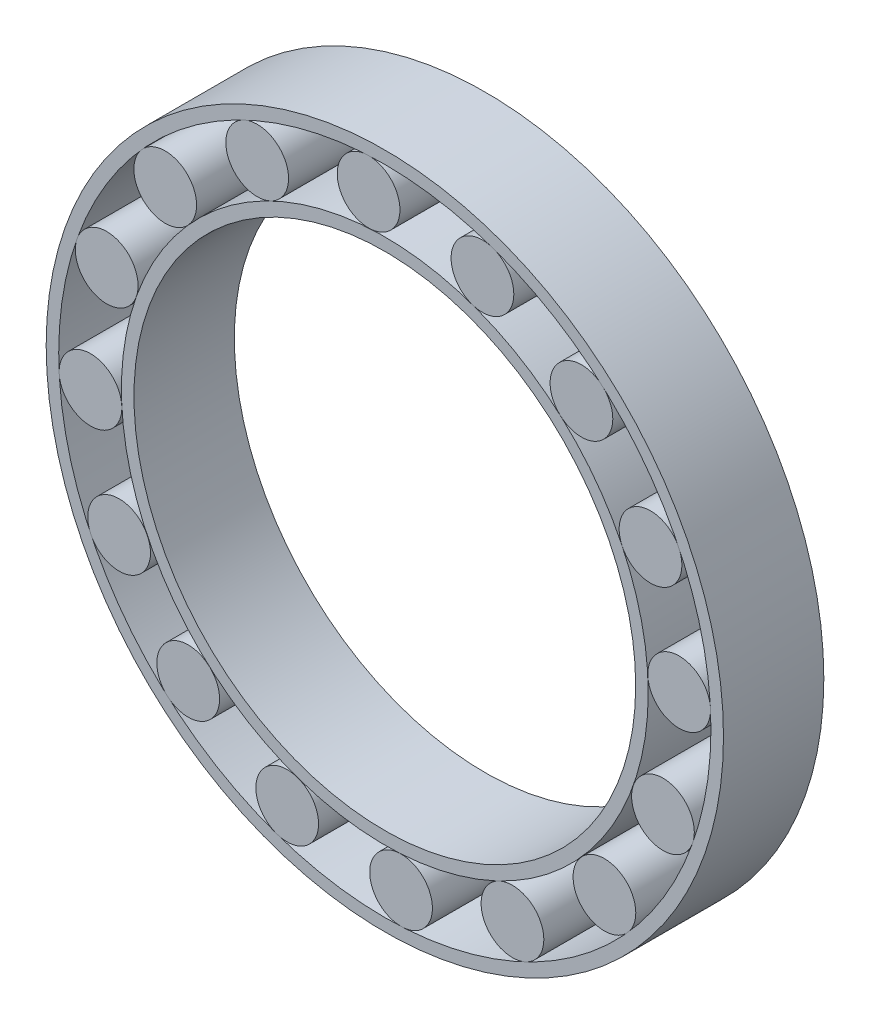
ISO-10303-21;
HEADER;
FILE_DESCRIPTION(('STEP AP214'),'2;1');
FILE_NAME('part.step','',(''),(''),'','','');
FILE_SCHEMA(('AUTOMOTIVE_DESIGN { 1 0 10303 214 1 1 1 1 }'));
ENDSEC;
DATA;
#1=APPLICATION_CONTEXT('core data for automotive mechanical design processes');
#2=APPLICATION_PROTOCOL_DEFINITION('international standard','automotive_design',2000,#1);
#3=PRODUCT_CONTEXT('',#1,'mechanical');
#4=PRODUCT('Part','Part','',(#3));
#5=PRODUCT_RELATED_PRODUCT_CATEGORY('part','',(#4));
#6=PRODUCT_DEFINITION_FORMATION('','',#4);
#7=PRODUCT_DEFINITION_CONTEXT('part definition',#1,'design');
#8=PRODUCT_DEFINITION('design','',#6,#7);
#9=PRODUCT_DEFINITION_SHAPE('','',#8);
#10=(LENGTH_UNIT() NAMED_UNIT(*) SI_UNIT(.MILLI.,.METRE.));
#11=(NAMED_UNIT(*) PLANE_ANGLE_UNIT() SI_UNIT($,.RADIAN.));
#12=(NAMED_UNIT(*) SI_UNIT($,.STERADIAN.) SOLID_ANGLE_UNIT());
#13=UNCERTAINTY_MEASURE_WITH_UNIT(LENGTH_MEASURE(1.E-05),#10,'distance_accuracy_value','');
#14=(GEOMETRIC_REPRESENTATION_CONTEXT(3) GLOBAL_UNCERTAINTY_ASSIGNED_CONTEXT((#13)) GLOBAL_UNIT_ASSIGNED_CONTEXT((#10,
#11,#12)) REPRESENTATION_CONTEXT('',''));
#15=CARTESIAN_POINT('',(0.,0.,0.));
#16=DIRECTION('',(0.,0.,1.));
#17=DIRECTION('',(1.,0.,0.));
#18=AXIS2_PLACEMENT_3D('',#15,#16,#17);
#19=CARTESIAN_POINT('',(7.83809885354114,8.75366816609632,4.));
#20=DIRECTION('',(0.,0.,-1.));
#21=DIRECTION('',(-1.,0.,0.));
#22=AXIS2_PLACEMENT_3D('',#19,#20,#21);
#23=CYLINDRICAL_SURFACE('',#22,1.2500000000001);
#24=CARTESIAN_POINT('',(7.83809885354114,8.75366816609632,4.));
#25=DIRECTION('',(0.,0.,1.));
#26=DIRECTION('',(1.,0.,0.));
#27=AXIS2_PLACEMENT_3D('',#24,#25,#26);
#28=CIRCLE('',#27,1.2500000000001);
#29=CARTESIAN_POINT('',(9.08809885354124,8.75366816609632,4.));
#30=VERTEX_POINT('',#29);
#31=EDGE_CURVE('E12',#30,#30,#28,.T.);
#32=ORIENTED_EDGE('',*,*,#31,.F.);
#33=EDGE_LOOP('',(#32));
#34=FACE_BOUND('',#33,.T.);
#35=CARTESIAN_POINT('',(7.83809885354114,8.75366816609632,0.));
#36=DIRECTION('',(0.,0.,1.));
#37=DIRECTION('',(1.,0.,0.));
#38=AXIS2_PLACEMENT_3D('',#35,#36,#37);
#39=CIRCLE('',#38,1.2500000000001);
#40=CARTESIAN_POINT('',(9.08809885354124,8.75366816609632,0.));
#41=VERTEX_POINT('',#40);
#42=EDGE_CURVE('E248',#41,#41,#39,.T.);
#43=ORIENTED_EDGE('',*,*,#42,.T.);
#44=EDGE_LOOP('',(#43));
#45=FACE_BOUND('',#44,.T.);
#46=ADVANCED_FACE('F245',(#34,#45),#23,.T.);
#47=CARTESIAN_POINT('',(0.,0.,4.));
#48=DIRECTION('',(0.,0.,1.));
#49=DIRECTION('',(1.,0.,0.));
#50=AXIS2_PLACEMENT_3D('',#47,#48,#49);
#51=PLANE('',#50);
#52=ORIENTED_EDGE('',*,*,#31,.T.);
#53=EDGE_LOOP('',(#52));
#54=FACE_BOUND('',#53,.T.);
#55=ADVANCED_FACE('F260',(#54),#51,.T.);
#56=CARTESIAN_POINT('',(0.,0.,0.));
#57=DIRECTION('',(0.,0.,1.));
#58=DIRECTION('',(1.,0.,0.));
#59=AXIS2_PLACEMENT_3D('',#56,#57,#58);
#60=PLANE('',#59);
#61=ORIENTED_EDGE('',*,*,#42,.F.);
#62=EDGE_LOOP('',(#61));
#63=FACE_BOUND('',#62,.T.);
#64=ADVANCED_FACE('F258',(#63),#60,.F.);
#65=CLOSED_SHELL('',(#46,#55,#64));
#66=MANIFOLD_SOLID_BREP('B2',#65);
#67=CARTESIAN_POINT('',(10.5913428841736,5.08782428056226,4.));
#68=DIRECTION('',(0.,0.,-1.));
#69=DIRECTION('',(-1.,0.,0.));
#70=AXIS2_PLACEMENT_3D('',#67,#68,#69);
#71=CYLINDRICAL_SURFACE('',#70,1.25000000000028);
#72=CARTESIAN_POINT('',(10.5913428841736,5.08782428056226,4.));
#73=DIRECTION('',(0.,0.,1.));
#74=DIRECTION('',(1.,0.,0.));
#75=AXIS2_PLACEMENT_3D('',#72,#73,#74);
#76=CIRCLE('',#75,1.25000000000028);
#77=CARTESIAN_POINT('',(11.8413428841739,5.08782428056226,4.));
#78=VERTEX_POINT('',#77);
#79=EDGE_CURVE('E244',#78,#78,#76,.T.);
#80=ORIENTED_EDGE('',*,*,#79,.F.);
#81=EDGE_LOOP('',(#80));
#82=FACE_BOUND('',#81,.T.);
#83=CARTESIAN_POINT('',(10.5913428841736,5.08782428056226,0.));
#84=DIRECTION('',(0.,0.,1.));
#85=DIRECTION('',(1.,0.,0.));
#86=AXIS2_PLACEMENT_3D('',#83,#84,#85);
#87=CIRCLE('',#86,1.25000000000028);
#88=CARTESIAN_POINT('',(11.8413428841739,5.08782428056226,0.));
#89=VERTEX_POINT('',#88);
#90=EDGE_CURVE('E302',#89,#89,#87,.T.);
#91=ORIENTED_EDGE('',*,*,#90,.T.);
#92=EDGE_LOOP('',(#91));
#93=FACE_BOUND('',#92,.T.);
#94=ADVANCED_FACE('F299',(#82,#93),#71,.T.);
#95=CARTESIAN_POINT('',(0.,0.,4.));
#96=DIRECTION('',(0.,0.,1.));
#97=DIRECTION('',(1.,0.,0.));
#98=AXIS2_PLACEMENT_3D('',#95,#96,#97);
#99=PLANE('',#98);
#100=ORIENTED_EDGE('',*,*,#79,.T.);
#101=EDGE_LOOP('',(#100));
#102=FACE_BOUND('',#101,.T.);
#103=ADVANCED_FACE('F314',(#102),#99,.T.);
#104=CARTESIAN_POINT('',(0.,0.,0.));
#105=DIRECTION('',(0.,0.,1.));
#106=DIRECTION('',(1.,0.,0.));
#107=AXIS2_PLACEMENT_3D('',#104,#105,#106);
#108=PLANE('',#107);
#109=ORIENTED_EDGE('',*,*,#90,.F.);
#110=EDGE_LOOP('',(#109));
#111=FACE_BOUND('',#110,.T.);
#112=ADVANCED_FACE('F312',(#111),#108,.F.);
#113=CLOSED_SHELL('',(#94,#103,#112));
#114=MANIFOLD_SOLID_BREP('B7',#113);
#115=CARTESIAN_POINT('',(11.7321509714531,0.647405269554554,4.));
#116=DIRECTION('',(0.,0.,-1.));
#117=DIRECTION('',(-1.,0.,0.));
#118=AXIS2_PLACEMENT_3D('',#115,#116,#117);
#119=CYLINDRICAL_SURFACE('',#118,1.25000000000053);
#120=CARTESIAN_POINT('',(11.7321509714531,0.647405269554554,4.));
#121=DIRECTION('',(0.,0.,1.));
#122=DIRECTION('',(1.,0.,0.));
#123=AXIS2_PLACEMENT_3D('',#120,#121,#122);
#124=CIRCLE('',#123,1.25000000000053);
#125=CARTESIAN_POINT('',(12.9821509714537,0.647405269554554,4.));
#126=VERTEX_POINT('',#125);
#127=EDGE_CURVE('E298',#126,#126,#124,.T.);
#128=ORIENTED_EDGE('',*,*,#127,.F.);
#129=EDGE_LOOP('',(#128));
#130=FACE_BOUND('',#129,.T.);
#131=CARTESIAN_POINT('',(11.7321509714531,0.647405269554554,0.));
#132=DIRECTION('',(0.,0.,1.));
#133=DIRECTION('',(1.,0.,0.));
#134=AXIS2_PLACEMENT_3D('',#131,#132,#133);
#135=CIRCLE('',#134,1.25000000000053);
#136=CARTESIAN_POINT('',(12.9821509714537,0.647405269554554,0.));
#137=VERTEX_POINT('',#136);
#138=EDGE_CURVE('E356',#137,#137,#135,.T.);
#139=ORIENTED_EDGE('',*,*,#138,.T.);
#140=EDGE_LOOP('',(#139));
#141=FACE_BOUND('',#140,.T.);
#142=ADVANCED_FACE('F353',(#130,#141),#119,.T.);
#143=CARTESIAN_POINT('',(0.,0.,4.));
#144=DIRECTION('',(0.,0.,1.));
#145=DIRECTION('',(1.,0.,0.));
#146=AXIS2_PLACEMENT_3D('',#143,#144,#145);
#147=PLANE('',#146);
#148=ORIENTED_EDGE('',*,*,#127,.T.);
#149=EDGE_LOOP('',(#148));
#150=FACE_BOUND('',#149,.T.);
#151=ADVANCED_FACE('F368',(#150),#147,.T.);
#152=CARTESIAN_POINT('',(0.,0.,0.));
#153=DIRECTION('',(0.,0.,1.));
#154=DIRECTION('',(1.,0.,0.));
#155=AXIS2_PLACEMENT_3D('',#152,#153,#154);
#156=PLANE('',#155);
#157=ORIENTED_EDGE('',*,*,#138,.F.);
#158=EDGE_LOOP('',(#157));
#159=FACE_BOUND('',#158,.T.);
#160=ADVANCED_FACE('F366',(#159),#156,.F.);
#161=CLOSED_SHELL('',(#142,#151,#160));
#162=MANIFOLD_SOLID_BREP('B239',#161);
#163=CARTESIAN_POINT('',(11.0868454255424,-3.89157532499944,4.));
#164=DIRECTION('',(0.,0.,-1.));
#165=DIRECTION('',(-1.,0.,0.));
#166=AXIS2_PLACEMENT_3D('',#163,#164,#165);
#167=CYLINDRICAL_SURFACE('',#166,1.2500000000008);
#168=CARTESIAN_POINT('',(11.0868454255424,-3.89157532499944,4.));
#169=DIRECTION('',(0.,0.,1.));
#170=DIRECTION('',(1.,0.,0.));
#171=AXIS2_PLACEMENT_3D('',#168,#169,#170);
#172=CIRCLE('',#171,1.2500000000008);
#173=CARTESIAN_POINT('',(12.3368454255432,-3.89157532499944,4.));
#174=VERTEX_POINT('',#173);
#175=EDGE_CURVE('E352',#174,#174,#172,.T.);
#176=ORIENTED_EDGE('',*,*,#175,.F.);
#177=EDGE_LOOP('',(#176));
#178=FACE_BOUND('',#177,.T.);
#179=CARTESIAN_POINT('',(11.0868454255424,-3.89157532499944,0.));
#180=DIRECTION('',(0.,0.,1.));
#181=DIRECTION('',(1.,0.,0.));
#182=AXIS2_PLACEMENT_3D('',#179,#180,#181);
#183=CIRCLE('',#182,1.2500000000008);
#184=CARTESIAN_POINT('',(12.3368454255432,-3.89157532499944,0.));
#185=VERTEX_POINT('',#184);
#186=EDGE_CURVE('E410',#185,#185,#183,.T.);
#187=ORIENTED_EDGE('',*,*,#186,.T.);
#188=EDGE_LOOP('',(#187));
#189=FACE_BOUND('',#188,.T.);
#190=ADVANCED_FACE('F407',(#178,#189),#167,.T.);
#191=CARTESIAN_POINT('',(0.,0.,4.));
#192=DIRECTION('',(0.,0.,1.));
#193=DIRECTION('',(1.,0.,0.));
#194=AXIS2_PLACEMENT_3D('',#191,#192,#193);
#195=PLANE('',#194);
#196=ORIENTED_EDGE('',*,*,#175,.T.);
#197=EDGE_LOOP('',(#196));
#198=FACE_BOUND('',#197,.T.);
#199=ADVANCED_FACE('F422',(#198),#195,.T.);
#200=CARTESIAN_POINT('',(0.,0.,0.));
#201=DIRECTION('',(0.,0.,1.));
#202=DIRECTION('',(1.,0.,0.));
#203=AXIS2_PLACEMENT_3D('',#200,#201,#202);
#204=PLANE('',#203);
#205=ORIENTED_EDGE('',*,*,#186,.F.);
#206=EDGE_LOOP('',(#205));
#207=FACE_BOUND('',#206,.T.);
#208=ADVANCED_FACE('F420',(#207),#204,.F.);
#209=CLOSED_SHELL('',(#190,#199,#208));
#210=MANIFOLD_SOLID_BREP('B293',#209);
#211=CARTESIAN_POINT('',(8.75366816609695,-7.83809885354044,4.));
#212=DIRECTION('',(0.,0.,-1.));
#213=DIRECTION('',(-1.,0.,0.));
#214=AXIS2_PLACEMENT_3D('',#211,#212,#213);
#215=CYLINDRICAL_SURFACE('',#214,1.25000000000106);
#216=CARTESIAN_POINT('',(8.75366816609695,-7.83809885354044,4.));
#217=DIRECTION('',(0.,0.,1.));
#218=DIRECTION('',(1.,0.,0.));
#219=AXIS2_PLACEMENT_3D('',#216,#217,#218);
#220=CIRCLE('',#219,1.25000000000106);
#221=CARTESIAN_POINT('',(10.003668166098,-7.83809885354044,4.));
#222=VERTEX_POINT('',#221);
#223=EDGE_CURVE('E406',#222,#222,#220,.T.);
#224=ORIENTED_EDGE('',*,*,#223,.F.);
#225=EDGE_LOOP('',(#224));
#226=FACE_BOUND('',#225,.T.);
#227=CARTESIAN_POINT('',(8.75366816609695,-7.83809885354044,0.));
#228=DIRECTION('',(0.,0.,1.));
#229=DIRECTION('',(1.,0.,0.));
#230=AXIS2_PLACEMENT_3D('',#227,#228,#229);
#231=CIRCLE('',#230,1.25000000000106);
#232=CARTESIAN_POINT('',(10.003668166098,-7.83809885354044,0.));
#233=VERTEX_POINT('',#232);
#234=EDGE_CURVE('E464',#233,#233,#231,.T.);
#235=ORIENTED_EDGE('',*,*,#234,.T.);
#236=EDGE_LOOP('',(#235));
#237=FACE_BOUND('',#236,.T.);
#238=ADVANCED_FACE('F461',(#226,#237),#215,.T.);
#239=CARTESIAN_POINT('',(0.,0.,4.));
#240=DIRECTION('',(0.,0.,1.));
#241=DIRECTION('',(1.,0.,0.));
#242=AXIS2_PLACEMENT_3D('',#239,#240,#241);
#243=PLANE('',#242);
#244=ORIENTED_EDGE('',*,*,#223,.T.);
#245=EDGE_LOOP('',(#244));
#246=FACE_BOUND('',#245,.T.);
#247=ADVANCED_FACE('F476',(#246),#243,.T.);
#248=CARTESIAN_POINT('',(0.,0.,0.));
#249=DIRECTION('',(0.,0.,1.));
#250=DIRECTION('',(1.,0.,0.));
#251=AXIS2_PLACEMENT_3D('',#248,#249,#250);
#252=PLANE('',#251);
#253=ORIENTED_EDGE('',*,*,#234,.F.);
#254=EDGE_LOOP('',(#253));
#255=FACE_BOUND('',#254,.T.);
#256=ADVANCED_FACE('F474',(#255),#252,.F.);
#257=CLOSED_SHELL('',(#238,#247,#256));
#258=MANIFOLD_SOLID_BREP('B347',#257);
#259=CARTESIAN_POINT('',(5.08782428056289,-10.5913428841729,4.));
#260=DIRECTION('',(0.,0.,-1.));
#261=DIRECTION('',(-1.,0.,0.));
#262=AXIS2_PLACEMENT_3D('',#259,#260,#261);
#263=CYLINDRICAL_SURFACE('',#262,1.25000000000126);
#264=CARTESIAN_POINT('',(5.08782428056289,-10.5913428841729,4.));
#265=DIRECTION('',(0.,0.,1.));
#266=DIRECTION('',(1.,0.,0.));
#267=AXIS2_PLACEMENT_3D('',#264,#265,#266);
#268=CIRCLE('',#267,1.25000000000126);
#269=CARTESIAN_POINT('',(6.33782428056415,-10.5913428841729,4.));
#270=VERTEX_POINT('',#269);
#271=EDGE_CURVE('E460',#270,#270,#268,.T.);
#272=ORIENTED_EDGE('',*,*,#271,.F.);
#273=EDGE_LOOP('',(#272));
#274=FACE_BOUND('',#273,.T.);
#275=CARTESIAN_POINT('',(5.08782428056289,-10.5913428841729,0.));
#276=DIRECTION('',(0.,0.,1.));
#277=DIRECTION('',(1.,0.,0.));
#278=AXIS2_PLACEMENT_3D('',#275,#276,#277);
#279=CIRCLE('',#278,1.25000000000126);
#280=CARTESIAN_POINT('',(6.33782428056415,-10.5913428841729,0.));
#281=VERTEX_POINT('',#280);
#282=EDGE_CURVE('E518',#281,#281,#279,.T.);
#283=ORIENTED_EDGE('',*,*,#282,.T.);
#284=EDGE_LOOP('',(#283));
#285=FACE_BOUND('',#284,.T.);
#286=ADVANCED_FACE('F515',(#274,#285),#263,.T.);
#287=CARTESIAN_POINT('',(0.,0.,4.));
#288=DIRECTION('',(0.,0.,1.));
#289=DIRECTION('',(1.,0.,0.));
#290=AXIS2_PLACEMENT_3D('',#287,#288,#289);
#291=PLANE('',#290);
#292=ORIENTED_EDGE('',*,*,#271,.T.);
#293=EDGE_LOOP('',(#292));
#294=FACE_BOUND('',#293,.T.);
#295=ADVANCED_FACE('F530',(#294),#291,.T.);
#296=CARTESIAN_POINT('',(0.,0.,0.));
#297=DIRECTION('',(0.,0.,1.));
#298=DIRECTION('',(1.,0.,0.));
#299=AXIS2_PLACEMENT_3D('',#296,#297,#298);
#300=PLANE('',#299);
#301=ORIENTED_EDGE('',*,*,#282,.F.);
#302=EDGE_LOOP('',(#301));
#303=FACE_BOUND('',#302,.T.);
#304=ADVANCED_FACE('F528',(#303),#300,.F.);
#305=CLOSED_SHELL('',(#286,#295,#304));
#306=MANIFOLD_SOLID_BREP('B401',#305);
#307=CARTESIAN_POINT('',(0.647405269555185,-11.7321509714524,4.));
#308=DIRECTION('',(0.,0.,-1.));
#309=DIRECTION('',(-1.,0.,0.));
#310=AXIS2_PLACEMENT_3D('',#307,#308,#309);
#311=CYLINDRICAL_SURFACE('',#310,1.25000000000138);
#312=CARTESIAN_POINT('',(0.647405269555185,-11.7321509714524,4.));
#313=DIRECTION('',(0.,0.,1.));
#314=DIRECTION('',(1.,0.,0.));
#315=AXIS2_PLACEMENT_3D('',#312,#313,#314);
#316=CIRCLE('',#315,1.25000000000138);
#317=CARTESIAN_POINT('',(1.89740526955656,-11.7321509714524,4.));
#318=VERTEX_POINT('',#317);
#319=EDGE_CURVE('E514',#318,#318,#316,.T.);
#320=ORIENTED_EDGE('',*,*,#319,.F.);
#321=EDGE_LOOP('',(#320));
#322=FACE_BOUND('',#321,.T.);
#323=CARTESIAN_POINT('',(0.647405269555185,-11.7321509714524,0.));
#324=DIRECTION('',(0.,0.,1.));
#325=DIRECTION('',(1.,0.,0.));
#326=AXIS2_PLACEMENT_3D('',#323,#324,#325);
#327=CIRCLE('',#326,1.25000000000138);
#328=CARTESIAN_POINT('',(1.89740526955656,-11.7321509714524,0.));
#329=VERTEX_POINT('',#328);
#330=EDGE_CURVE('E572',#329,#329,#327,.T.);
#331=ORIENTED_EDGE('',*,*,#330,.T.);
#332=EDGE_LOOP('',(#331));
#333=FACE_BOUND('',#332,.T.);
#334=ADVANCED_FACE('F569',(#322,#333),#311,.T.);
#335=CARTESIAN_POINT('',(0.,0.,4.));
#336=DIRECTION('',(0.,0.,1.));
#337=DIRECTION('',(1.,0.,0.));
#338=AXIS2_PLACEMENT_3D('',#335,#336,#337);
#339=PLANE('',#338);
#340=ORIENTED_EDGE('',*,*,#319,.T.);
#341=EDGE_LOOP('',(#340));
#342=FACE_BOUND('',#341,.T.);
#343=ADVANCED_FACE('F584',(#342),#339,.T.);
#344=CARTESIAN_POINT('',(0.,0.,0.));
#345=DIRECTION('',(0.,0.,1.));
#346=DIRECTION('',(1.,0.,0.));
#347=AXIS2_PLACEMENT_3D('',#344,#345,#346);
#348=PLANE('',#347);
#349=ORIENTED_EDGE('',*,*,#330,.F.);
#350=EDGE_LOOP('',(#349));
#351=FACE_BOUND('',#350,.T.);
#352=ADVANCED_FACE('F582',(#351),#348,.F.);
#353=CLOSED_SHELL('',(#334,#343,#352));
#354=MANIFOLD_SOLID_BREP('B455',#353);
#355=CARTESIAN_POINT('',(-3.89157532499881,-11.0868454255417,4.));
#356=DIRECTION('',(0.,0.,-1.));
#357=DIRECTION('',(-1.,0.,0.));
#358=AXIS2_PLACEMENT_3D('',#355,#356,#357);
#359=CYLINDRICAL_SURFACE('',#358,1.2500000000014);
#360=CARTESIAN_POINT('',(-3.89157532499881,-11.0868454255417,4.));
#361=DIRECTION('',(0.,0.,1.));
#362=DIRECTION('',(1.,0.,0.));
#363=AXIS2_PLACEMENT_3D('',#360,#361,#362);
#364=CIRCLE('',#363,1.2500000000014);
#365=CARTESIAN_POINT('',(-2.64157532499741,-11.0868454255417,4.));
#366=VERTEX_POINT('',#365);
#367=EDGE_CURVE('E568',#366,#366,#364,.T.);
#368=ORIENTED_EDGE('',*,*,#367,.F.);
#369=EDGE_LOOP('',(#368));
#370=FACE_BOUND('',#369,.T.);
#371=CARTESIAN_POINT('',(-3.89157532499881,-11.0868454255417,0.));
#372=DIRECTION('',(0.,0.,1.));
#373=DIRECTION('',(1.,0.,0.));
#374=AXIS2_PLACEMENT_3D('',#371,#372,#373);
#375=CIRCLE('',#374,1.2500000000014);
#376=CARTESIAN_POINT('',(-2.64157532499741,-11.0868454255417,0.));
#377=VERTEX_POINT('',#376);
#378=EDGE_CURVE('E626',#377,#377,#375,.T.);
#379=ORIENTED_EDGE('',*,*,#378,.T.);
#380=EDGE_LOOP('',(#379));
#381=FACE_BOUND('',#380,.T.);
#382=ADVANCED_FACE('F623',(#370,#381),#359,.T.);
#383=CARTESIAN_POINT('',(0.,0.,4.));
#384=DIRECTION('',(0.,0.,1.));
#385=DIRECTION('',(1.,0.,0.));
#386=AXIS2_PLACEMENT_3D('',#383,#384,#385);
#387=PLANE('',#386);
#388=ORIENTED_EDGE('',*,*,#367,.T.);
#389=EDGE_LOOP('',(#388));
#390=FACE_BOUND('',#389,.T.);
#391=ADVANCED_FACE('F638',(#390),#387,.T.);
#392=CARTESIAN_POINT('',(0.,0.,0.));
#393=DIRECTION('',(0.,0.,1.));
#394=DIRECTION('',(1.,0.,0.));
#395=AXIS2_PLACEMENT_3D('',#392,#393,#394);
#396=PLANE('',#395);
#397=ORIENTED_EDGE('',*,*,#378,.F.);
#398=EDGE_LOOP('',(#397));
#399=FACE_BOUND('',#398,.T.);
#400=ADVANCED_FACE('F636',(#399),#396,.F.);
#401=CLOSED_SHELL('',(#382,#391,#400));
#402=MANIFOLD_SOLID_BREP('B509',#401);
#403=CARTESIAN_POINT('',(-7.83809885353981,-8.75366816609625,4.));
#404=DIRECTION('',(0.,0.,-1.));
#405=DIRECTION('',(-1.,0.,0.));
#406=AXIS2_PLACEMENT_3D('',#403,#404,#405);
#407=CYLINDRICAL_SURFACE('',#406,1.25000000000132);
#408=CARTESIAN_POINT('',(-7.83809885353981,-8.75366816609625,4.));
#409=DIRECTION('',(0.,0.,1.));
#410=DIRECTION('',(1.,0.,0.));
#411=AXIS2_PLACEMENT_3D('',#408,#409,#410);
#412=CIRCLE('',#411,1.25000000000132);
#413=CARTESIAN_POINT('',(-6.58809885353848,-8.75366816609625,4.));
#414=VERTEX_POINT('',#413);
#415=EDGE_CURVE('E622',#414,#414,#412,.T.);
#416=ORIENTED_EDGE('',*,*,#415,.F.);
#417=EDGE_LOOP('',(#416));
#418=FACE_BOUND('',#417,.T.);
#419=CARTESIAN_POINT('',(-7.83809885353981,-8.75366816609625,0.));
#420=DIRECTION('',(0.,0.,1.));
#421=DIRECTION('',(1.,0.,0.));
#422=AXIS2_PLACEMENT_3D('',#419,#420,#421);
#423=CIRCLE('',#422,1.25000000000132);
#424=CARTESIAN_POINT('',(-6.58809885353848,-8.75366816609625,0.));
#425=VERTEX_POINT('',#424);
#426=EDGE_CURVE('E680',#425,#425,#423,.T.);
#427=ORIENTED_EDGE('',*,*,#426,.T.);
#428=EDGE_LOOP('',(#427));
#429=FACE_BOUND('',#428,.T.);
#430=ADVANCED_FACE('F677',(#418,#429),#407,.T.);
#431=CARTESIAN_POINT('',(0.,0.,4.));
#432=DIRECTION('',(0.,0.,1.));
#433=DIRECTION('',(1.,0.,0.));
#434=AXIS2_PLACEMENT_3D('',#431,#432,#433);
#435=PLANE('',#434);
#436=ORIENTED_EDGE('',*,*,#415,.T.);
#437=EDGE_LOOP('',(#436));
#438=FACE_BOUND('',#437,.T.);
#439=ADVANCED_FACE('F692',(#438),#435,.T.);
#440=CARTESIAN_POINT('',(0.,0.,0.));
#441=DIRECTION('',(0.,0.,1.));
#442=DIRECTION('',(1.,0.,0.));
#443=AXIS2_PLACEMENT_3D('',#440,#441,#442);
#444=PLANE('',#443);
#445=ORIENTED_EDGE('',*,*,#426,.F.);
#446=EDGE_LOOP('',(#445));
#447=FACE_BOUND('',#446,.T.);
#448=ADVANCED_FACE('F690',(#447),#444,.F.);
#449=CLOSED_SHELL('',(#430,#439,#448));
#450=MANIFOLD_SOLID_BREP('B563',#449);
#451=CARTESIAN_POINT('',(-10.5913428841723,-5.08782428056219,4.));
#452=DIRECTION('',(0.,0.,-1.));
#453=DIRECTION('',(-1.,0.,0.));
#454=AXIS2_PLACEMENT_3D('',#451,#452,#453);
#455=CYLINDRICAL_SURFACE('',#454,1.25000000000117);
#456=CARTESIAN_POINT('',(-10.5913428841723,-5.08782428056219,4.));
#457=DIRECTION('',(0.,0.,1.));
#458=DIRECTION('',(1.,0.,0.));
#459=AXIS2_PLACEMENT_3D('',#456,#457,#458);
#460=CIRCLE('',#459,1.25000000000117);
#461=CARTESIAN_POINT('',(-9.34134288417114,-5.08782428056219,4.));
#462=VERTEX_POINT('',#461);
#463=EDGE_CURVE('E676',#462,#462,#460,.T.);
#464=ORIENTED_EDGE('',*,*,#463,.F.);
#465=EDGE_LOOP('',(#464));
#466=FACE_BOUND('',#465,.T.);
#467=CARTESIAN_POINT('',(-10.5913428841723,-5.08782428056219,0.));
#468=DIRECTION('',(0.,0.,1.));
#469=DIRECTION('',(1.,0.,0.));
#470=AXIS2_PLACEMENT_3D('',#467,#468,#469);
#471=CIRCLE('',#470,1.25000000000117);
#472=CARTESIAN_POINT('',(-9.34134288417114,-5.08782428056219,0.));
#473=VERTEX_POINT('',#472);
#474=EDGE_CURVE('E734',#473,#473,#471,.T.);
#475=ORIENTED_EDGE('',*,*,#474,.T.);
#476=EDGE_LOOP('',(#475));
#477=FACE_BOUND('',#476,.T.);
#478=ADVANCED_FACE('F731',(#466,#477),#455,.T.);
#479=CARTESIAN_POINT('',(0.,0.,4.));
#480=DIRECTION('',(0.,0.,1.));
#481=DIRECTION('',(1.,0.,0.));
#482=AXIS2_PLACEMENT_3D('',#479,#480,#481);
#483=PLANE('',#482);
#484=ORIENTED_EDGE('',*,*,#463,.T.);
#485=EDGE_LOOP('',(#484));
#486=FACE_BOUND('',#485,.T.);
#487=ADVANCED_FACE('F746',(#486),#483,.T.);
#488=CARTESIAN_POINT('',(0.,0.,0.));
#489=DIRECTION('',(0.,0.,1.));
#490=DIRECTION('',(1.,0.,0.));
#491=AXIS2_PLACEMENT_3D('',#488,#489,#490);
#492=PLANE('',#491);
#493=ORIENTED_EDGE('',*,*,#474,.F.);
#494=EDGE_LOOP('',(#493));
#495=FACE_BOUND('',#494,.T.);
#496=ADVANCED_FACE('F744',(#495),#492,.F.);
#497=CLOSED_SHELL('',(#478,#487,#496));
#498=MANIFOLD_SOLID_BREP('B617',#497);
#499=CARTESIAN_POINT('',(-11.7321509714518,-0.647405269554483,4.));
#500=DIRECTION('',(0.,0.,-1.));
#501=DIRECTION('',(-1.,0.,0.));
#502=AXIS2_PLACEMENT_3D('',#499,#500,#501);
#503=CYLINDRICAL_SURFACE('',#502,1.25000000000093);
#504=CARTESIAN_POINT('',(-11.7321509714518,-0.647405269554483,4.));
#505=DIRECTION('',(0.,0.,1.));
#506=DIRECTION('',(1.,0.,0.));
#507=AXIS2_PLACEMENT_3D('',#504,#505,#506);
#508=CIRCLE('',#507,1.25000000000093);
#509=CARTESIAN_POINT('',(-10.4821509714509,-0.647405269554483,4.));
#510=VERTEX_POINT('',#509);
#511=EDGE_CURVE('E730',#510,#510,#508,.T.);
#512=ORIENTED_EDGE('',*,*,#511,.F.);
#513=EDGE_LOOP('',(#512));
#514=FACE_BOUND('',#513,.T.);
#515=CARTESIAN_POINT('',(-11.7321509714518,-0.647405269554483,0.));
#516=DIRECTION('',(0.,0.,1.));
#517=DIRECTION('',(1.,0.,0.));
#518=AXIS2_PLACEMENT_3D('',#515,#516,#517);
#519=CIRCLE('',#518,1.25000000000093);
#520=CARTESIAN_POINT('',(-10.4821509714509,-0.647405269554483,0.));
#521=VERTEX_POINT('',#520);
#522=EDGE_CURVE('E788',#521,#521,#519,.T.);
#523=ORIENTED_EDGE('',*,*,#522,.T.);
#524=EDGE_LOOP('',(#523));
#525=FACE_BOUND('',#524,.T.);
#526=ADVANCED_FACE('F785',(#514,#525),#503,.T.);
#527=CARTESIAN_POINT('',(0.,0.,4.));
#528=DIRECTION('',(0.,0.,1.));
#529=DIRECTION('',(1.,0.,0.));
#530=AXIS2_PLACEMENT_3D('',#527,#528,#529);
#531=PLANE('',#530);
#532=ORIENTED_EDGE('',*,*,#511,.T.);
#533=EDGE_LOOP('',(#532));
#534=FACE_BOUND('',#533,.T.);
#535=ADVANCED_FACE('F800',(#534),#531,.T.);
#536=CARTESIAN_POINT('',(0.,0.,0.));
#537=DIRECTION('',(0.,0.,1.));
#538=DIRECTION('',(1.,0.,0.));
#539=AXIS2_PLACEMENT_3D('',#536,#537,#538);
#540=PLANE('',#539);
#541=ORIENTED_EDGE('',*,*,#522,.F.);
#542=EDGE_LOOP('',(#541));
#543=FACE_BOUND('',#542,.T.);
#544=ADVANCED_FACE('F798',(#543),#540,.F.);
#545=CLOSED_SHELL('',(#526,#535,#544));
#546=MANIFOLD_SOLID_BREP('B671',#545);
#547=CARTESIAN_POINT('',(-11.086845425541,3.89157532499952,4.));
#548=DIRECTION('',(0.,0.,-1.));
#549=DIRECTION('',(-1.,0.,0.));
#550=AXIS2_PLACEMENT_3D('',#547,#548,#549);
#551=CYLINDRICAL_SURFACE('',#550,1.25000000000067);
#552=CARTESIAN_POINT('',(-11.086845425541,3.89157532499952,4.));
#553=DIRECTION('',(0.,0.,1.));
#554=DIRECTION('',(1.,0.,0.));
#555=AXIS2_PLACEMENT_3D('',#552,#553,#554);
#556=CIRCLE('',#555,1.25000000000067);
#557=CARTESIAN_POINT('',(-9.83684542554037,3.89157532499952,4.));
#558=VERTEX_POINT('',#557);
#559=EDGE_CURVE('E784',#558,#558,#556,.T.);
#560=ORIENTED_EDGE('',*,*,#559,.F.);
#561=EDGE_LOOP('',(#560));
#562=FACE_BOUND('',#561,.T.);
#563=CARTESIAN_POINT('',(-11.086845425541,3.89157532499952,0.));
#564=DIRECTION('',(0.,0.,1.));
#565=DIRECTION('',(1.,0.,0.));
#566=AXIS2_PLACEMENT_3D('',#563,#564,#565);
#567=CIRCLE('',#566,1.25000000000067);
#568=CARTESIAN_POINT('',(-9.83684542554037,3.89157532499952,0.));
#569=VERTEX_POINT('',#568);
#570=EDGE_CURVE('E842',#569,#569,#567,.T.);
#571=ORIENTED_EDGE('',*,*,#570,.T.);
#572=EDGE_LOOP('',(#571));
#573=FACE_BOUND('',#572,.T.);
#574=ADVANCED_FACE('F839',(#562,#573),#551,.T.);
#575=CARTESIAN_POINT('',(0.,0.,4.));
#576=DIRECTION('',(0.,0.,1.));
#577=DIRECTION('',(1.,0.,0.));
#578=AXIS2_PLACEMENT_3D('',#575,#576,#577);
#579=PLANE('',#578);
#580=ORIENTED_EDGE('',*,*,#559,.T.);
#581=EDGE_LOOP('',(#580));
#582=FACE_BOUND('',#581,.T.);
#583=ADVANCED_FACE('F854',(#582),#579,.T.);
#584=CARTESIAN_POINT('',(0.,0.,0.));
#585=DIRECTION('',(0.,0.,1.));
#586=DIRECTION('',(1.,0.,0.));
#587=AXIS2_PLACEMENT_3D('',#584,#585,#586);
#588=PLANE('',#587);
#589=ORIENTED_EDGE('',*,*,#570,.F.);
#590=EDGE_LOOP('',(#589));
#591=FACE_BOUND('',#590,.T.);
#592=ADVANCED_FACE('F852',(#591),#588,.F.);
#593=CLOSED_SHELL('',(#574,#583,#592));
#594=MANIFOLD_SOLID_BREP('B725',#593);
#595=CARTESIAN_POINT('',(-8.75366816609562,7.83809885354051,4.));
#596=DIRECTION('',(0.,0.,-1.));
#597=DIRECTION('',(-1.,0.,0.));
#598=AXIS2_PLACEMENT_3D('',#595,#596,#597);
#599=CYLINDRICAL_SURFACE('',#598,1.25000000000045);
#600=CARTESIAN_POINT('',(-8.75366816609562,7.83809885354051,4.));
#601=DIRECTION('',(0.,0.,1.));
#602=DIRECTION('',(1.,0.,0.));
#603=AXIS2_PLACEMENT_3D('',#600,#601,#602);
#604=CIRCLE('',#603,1.25000000000045);
#605=CARTESIAN_POINT('',(-7.50366816609517,7.83809885354051,4.));
#606=VERTEX_POINT('',#605);
#607=EDGE_CURVE('E838',#606,#606,#604,.T.);
#608=ORIENTED_EDGE('',*,*,#607,.F.);
#609=EDGE_LOOP('',(#608));
#610=FACE_BOUND('',#609,.T.);
#611=CARTESIAN_POINT('',(-8.75366816609562,7.83809885354051,0.));
#612=DIRECTION('',(0.,0.,1.));
#613=DIRECTION('',(1.,0.,0.));
#614=AXIS2_PLACEMENT_3D('',#611,#612,#613);
#615=CIRCLE('',#614,1.25000000000045);
#616=CARTESIAN_POINT('',(-7.50366816609517,7.83809885354051,0.));
#617=VERTEX_POINT('',#616);
#618=EDGE_CURVE('E896',#617,#617,#615,.T.);
#619=ORIENTED_EDGE('',*,*,#618,.T.);
#620=EDGE_LOOP('',(#619));
#621=FACE_BOUND('',#620,.T.);
#622=ADVANCED_FACE('F893',(#610,#621),#599,.T.);
#623=CARTESIAN_POINT('',(0.,0.,4.));
#624=DIRECTION('',(0.,0.,1.));
#625=DIRECTION('',(1.,0.,0.));
#626=AXIS2_PLACEMENT_3D('',#623,#624,#625);
#627=PLANE('',#626);
#628=ORIENTED_EDGE('',*,*,#607,.T.);
#629=EDGE_LOOP('',(#628));
#630=FACE_BOUND('',#629,.T.);
#631=ADVANCED_FACE('F908',(#630),#627,.T.);
#632=CARTESIAN_POINT('',(0.,0.,0.));
#633=DIRECTION('',(0.,0.,1.));
#634=DIRECTION('',(1.,0.,0.));
#635=AXIS2_PLACEMENT_3D('',#632,#633,#634);
#636=PLANE('',#635);
#637=ORIENTED_EDGE('',*,*,#618,.F.);
#638=EDGE_LOOP('',(#637));
#639=FACE_BOUND('',#638,.T.);
#640=ADVANCED_FACE('F906',(#639),#636,.F.);
#641=CLOSED_SHELL('',(#622,#631,#640));
#642=MANIFOLD_SOLID_BREP('B779',#641);
#643=CARTESIAN_POINT('',(3.89157532500012,11.0868454255415,4.));
#644=DIRECTION('',(0.,0.,-1.));
#645=DIRECTION('',(-1.,0.,0.));
#646=AXIS2_PLACEMENT_3D('',#643,#644,#645);
#647=CYLINDRICAL_SURFACE('',#646,1.25);
#648=CARTESIAN_POINT('',(3.89157532500012,11.0868454255415,4.));
#649=DIRECTION('',(0.,0.,1.));
#650=DIRECTION('',(1.,0.,0.));
#651=AXIS2_PLACEMENT_3D('',#648,#649,#650);
#652=CIRCLE('',#651,1.25);
#653=CARTESIAN_POINT('',(5.14157532500012,11.0868454255415,4.));
#654=VERTEX_POINT('',#653);
#655=EDGE_CURVE('E892',#654,#654,#652,.T.);
#656=ORIENTED_EDGE('',*,*,#655,.F.);
#657=EDGE_LOOP('',(#656));
#658=FACE_BOUND('',#657,.T.);
#659=CARTESIAN_POINT('',(3.89157532500012,11.0868454255415,0.));
#660=DIRECTION('',(0.,0.,1.));
#661=DIRECTION('',(1.,0.,0.));
#662=AXIS2_PLACEMENT_3D('',#659,#660,#661);
#663=CIRCLE('',#662,1.25);
#664=CARTESIAN_POINT('',(5.14157532500012,11.0868454255415,0.));
#665=VERTEX_POINT('',#664);
#666=EDGE_CURVE('E950',#665,#665,#663,.T.);
#667=ORIENTED_EDGE('',*,*,#666,.T.);
#668=EDGE_LOOP('',(#667));
#669=FACE_BOUND('',#668,.T.);
#670=ADVANCED_FACE('F947',(#658,#669),#647,.T.);
#671=CARTESIAN_POINT('',(0.,0.,4.));
#672=DIRECTION('',(0.,0.,1.));
#673=DIRECTION('',(1.,0.,0.));
#674=AXIS2_PLACEMENT_3D('',#671,#672,#673);
#675=PLANE('',#674);
#676=ORIENTED_EDGE('',*,*,#655,.T.);
#677=EDGE_LOOP('',(#676));
#678=FACE_BOUND('',#677,.T.);
#679=ADVANCED_FACE('F962',(#678),#675,.T.);
#680=CARTESIAN_POINT('',(0.,0.,0.));
#681=DIRECTION('',(0.,0.,1.));
#682=DIRECTION('',(1.,0.,0.));
#683=AXIS2_PLACEMENT_3D('',#680,#681,#682);
#684=PLANE('',#683);
#685=ORIENTED_EDGE('',*,*,#666,.F.);
#686=EDGE_LOOP('',(#685));
#687=FACE_BOUND('',#686,.T.);
#688=ADVANCED_FACE('F960',(#687),#684,.F.);
#689=CLOSED_SHELL('',(#670,#679,#688));
#690=MANIFOLD_SOLID_BREP('B833',#689);
#691=CARTESIAN_POINT('',(-0.64740526955385,11.7321509714525,4.));
#692=DIRECTION('',(0.,0.,-1.));
#693=DIRECTION('',(-1.,0.,0.));
#694=AXIS2_PLACEMENT_3D('',#691,#692,#693);
#695=CYLINDRICAL_SURFACE('',#694,1.25);
#696=CARTESIAN_POINT('',(-0.64740526955385,11.7321509714525,4.));
#697=DIRECTION('',(0.,0.,1.));
#698=DIRECTION('',(1.,0.,0.));
#699=AXIS2_PLACEMENT_3D('',#696,#697,#698);
#700=CIRCLE('',#699,1.25);
#701=CARTESIAN_POINT('',(0.60259473044615,11.7321509714525,4.));
#702=VERTEX_POINT('',#701);
#703=EDGE_CURVE('E946',#702,#702,#700,.T.);
#704=ORIENTED_EDGE('',*,*,#703,.F.);
#705=EDGE_LOOP('',(#704));
#706=FACE_BOUND('',#705,.T.);
#707=CARTESIAN_POINT('',(-0.64740526955385,11.7321509714525,0.));
#708=DIRECTION('',(0.,0.,1.));
#709=DIRECTION('',(1.,0.,0.));
#710=AXIS2_PLACEMENT_3D('',#707,#708,#709);
#711=CIRCLE('',#710,1.25);
#712=CARTESIAN_POINT('',(0.60259473044615,11.7321509714525,0.));
#713=VERTEX_POINT('',#712);
#714=EDGE_CURVE('E1004',#713,#713,#711,.T.);
#715=ORIENTED_EDGE('',*,*,#714,.T.);
#716=EDGE_LOOP('',(#715));
#717=FACE_BOUND('',#716,.T.);
#718=ADVANCED_FACE('F1001',(#706,#717),#695,.T.);
#719=CARTESIAN_POINT('',(0.,0.,4.));
#720=DIRECTION('',(0.,0.,1.));
#721=DIRECTION('',(1.,0.,0.));
#722=AXIS2_PLACEMENT_3D('',#719,#720,#721);
#723=PLANE('',#722);
#724=ORIENTED_EDGE('',*,*,#703,.T.);
#725=EDGE_LOOP('',(#724));
#726=FACE_BOUND('',#725,.T.);
#727=ADVANCED_FACE('F1016',(#726),#723,.T.);
#728=CARTESIAN_POINT('',(0.,0.,0.));
#729=DIRECTION('',(0.,0.,1.));
#730=DIRECTION('',(1.,0.,0.));
#731=AXIS2_PLACEMENT_3D('',#728,#729,#730);
#732=PLANE('',#731);
#733=ORIENTED_EDGE('',*,*,#714,.F.);
#734=EDGE_LOOP('',(#733));
#735=FACE_BOUND('',#734,.T.);
#736=ADVANCED_FACE('F1014',(#735),#732,.F.);
#737=CLOSED_SHELL('',(#718,#727,#736));
#738=MANIFOLD_SOLID_BREP('B887',#737);
#739=CARTESIAN_POINT('',(-5.08782428056156,10.591342884173,4.));
#740=DIRECTION('',(0.,0.,-1.));
#741=DIRECTION('',(-1.,0.,0.));
#742=AXIS2_PLACEMENT_3D('',#739,#740,#741);
#743=CYLINDRICAL_SURFACE('',#742,1.25000000000027);
#744=CARTESIAN_POINT('',(-5.08782428056156,10.591342884173,4.));
#745=DIRECTION('',(0.,0.,1.));
#746=DIRECTION('',(1.,0.,0.));
#747=AXIS2_PLACEMENT_3D('',#744,#745,#746);
#748=CIRCLE('',#747,1.25000000000027);
#749=CARTESIAN_POINT('',(-3.83782428056129,10.591342884173,4.));
#750=VERTEX_POINT('',#749);
#751=EDGE_CURVE('E1000',#750,#750,#748,.T.);
#752=ORIENTED_EDGE('',*,*,#751,.F.);
#753=EDGE_LOOP('',(#752));
#754=FACE_BOUND('',#753,.T.);
#755=CARTESIAN_POINT('',(-5.08782428056156,10.591342884173,0.));
#756=DIRECTION('',(0.,0.,1.));
#757=DIRECTION('',(1.,0.,0.));
#758=AXIS2_PLACEMENT_3D('',#755,#756,#757);
#759=CIRCLE('',#758,1.25000000000027);
#760=CARTESIAN_POINT('',(-3.83782428056129,10.591342884173,0.));
#761=VERTEX_POINT('',#760);
#762=EDGE_CURVE('E1058',#761,#761,#759,.T.);
#763=ORIENTED_EDGE('',*,*,#762,.T.);
#764=EDGE_LOOP('',(#763));
#765=FACE_BOUND('',#764,.T.);
#766=ADVANCED_FACE('F1055',(#754,#765),#743,.T.);
#767=CARTESIAN_POINT('',(0.,0.,4.));
#768=DIRECTION('',(0.,0.,1.));
#769=DIRECTION('',(1.,0.,0.));
#770=AXIS2_PLACEMENT_3D('',#767,#768,#769);
#771=PLANE('',#770);
#772=ORIENTED_EDGE('',*,*,#751,.T.);
#773=EDGE_LOOP('',(#772));
#774=FACE_BOUND('',#773,.T.);
#775=ADVANCED_FACE('F1070',(#774),#771,.T.);
#776=CARTESIAN_POINT('',(0.,0.,0.));
#777=DIRECTION('',(0.,0.,1.));
#778=DIRECTION('',(1.,0.,0.));
#779=AXIS2_PLACEMENT_3D('',#776,#777,#778);
#780=PLANE('',#779);
#781=ORIENTED_EDGE('',*,*,#762,.F.);
#782=EDGE_LOOP('',(#781));
#783=FACE_BOUND('',#782,.T.);
#784=ADVANCED_FACE('F1068',(#783),#780,.F.);
#785=CLOSED_SHELL('',(#766,#775,#784));
#786=MANIFOLD_SOLID_BREP('B941',#785);
#787=CARTESIAN_POINT('',(0.,0.,4.));
#788=DIRECTION('',(0.,0.,-1.));
#789=DIRECTION('',(-1.,0.,0.));
#790=AXIS2_PLACEMENT_3D('',#787,#788,#789);
#791=CYLINDRICAL_SURFACE('',#790,10.);
#792=CARTESIAN_POINT('',(0.,0.,4.));
#793=DIRECTION('',(0.,0.,1.));
#794=DIRECTION('',(1.,0.,0.));
#795=AXIS2_PLACEMENT_3D('',#792,#793,#794);
#796=CIRCLE('',#795,10.);
#797=CARTESIAN_POINT('',(10.,0.,4.));
#798=VERTEX_POINT('',#797);
#799=EDGE_CURVE('E1115',#798,#798,#796,.T.);
#800=ORIENTED_EDGE('',*,*,#799,.T.);
#801=EDGE_LOOP('',(#800));
#802=FACE_BOUND('',#801,.T.);
#803=CARTESIAN_POINT('',(0.,0.,0.));
#804=DIRECTION('',(0.,0.,1.));
#805=DIRECTION('',(1.,0.,0.));
#806=AXIS2_PLACEMENT_3D('',#803,#804,#805);
#807=CIRCLE('',#806,10.);
#808=CARTESIAN_POINT('',(10.,0.,0.));
#809=VERTEX_POINT('',#808);
#810=EDGE_CURVE('E1121',#809,#809,#807,.T.);
#811=ORIENTED_EDGE('',*,*,#810,.F.);
#812=EDGE_LOOP('',(#811));
#813=FACE_BOUND('',#812,.T.);
#814=ADVANCED_FACE('F1108',(#802,#813),#791,.F.);
#815=CARTESIAN_POINT('',(0.,0.,4.));
#816=DIRECTION('',(0.,0.,-1.));
#817=DIRECTION('',(-1.,0.,0.));
#818=AXIS2_PLACEMENT_3D('',#815,#816,#817);
#819=CYLINDRICAL_SURFACE('',#818,10.5);
#820=CARTESIAN_POINT('',(0.,0.,4.));
#821=DIRECTION('',(0.,0.,1.));
#822=DIRECTION('',(1.,0.,0.));
#823=AXIS2_PLACEMENT_3D('',#820,#821,#822);
#824=CIRCLE('',#823,10.5);
#825=CARTESIAN_POINT('',(10.5,0.,4.));
#826=VERTEX_POINT('',#825);
#827=EDGE_CURVE('E1054',#826,#826,#824,.T.);
#828=ORIENTED_EDGE('',*,*,#827,.F.);
#829=EDGE_LOOP('',(#828));
#830=FACE_BOUND('',#829,.T.);
#831=CARTESIAN_POINT('',(0.,0.,0.));
#832=DIRECTION('',(0.,0.,1.));
#833=DIRECTION('',(1.,0.,0.));
#834=AXIS2_PLACEMENT_3D('',#831,#832,#833);
#835=CIRCLE('',#834,10.5);
#836=CARTESIAN_POINT('',(10.5,0.,0.));
#837=VERTEX_POINT('',#836);
#838=EDGE_CURVE('E1111',#837,#837,#835,.T.);
#839=ORIENTED_EDGE('',*,*,#838,.T.);
#840=EDGE_LOOP('',(#839));
#841=FACE_BOUND('',#840,.T.);
#842=ADVANCED_FACE('F1128',(#830,#841),#819,.T.);
#843=CARTESIAN_POINT('',(0.,0.,4.));
#844=DIRECTION('',(0.,0.,1.));
#845=DIRECTION('',(1.,0.,0.));
#846=AXIS2_PLACEMENT_3D('',#843,#844,#845);
#847=PLANE('',#846);
#848=ORIENTED_EDGE('',*,*,#799,.F.);
#849=EDGE_LOOP('',(#848));
#850=FACE_BOUND('',#849,.T.);
#851=ORIENTED_EDGE('',*,*,#827,.T.);
#852=EDGE_LOOP('',(#851));
#853=FACE_BOUND('',#852,.T.);
#854=ADVANCED_FACE('F1132',(#850,#853),#847,.T.);
#855=CARTESIAN_POINT('',(0.,0.,0.));
#856=DIRECTION('',(0.,0.,1.));
#857=DIRECTION('',(1.,0.,0.));
#858=AXIS2_PLACEMENT_3D('',#855,#856,#857);
#859=PLANE('',#858);
#860=ORIENTED_EDGE('',*,*,#810,.T.);
#861=EDGE_LOOP('',(#860));
#862=FACE_BOUND('',#861,.T.);
#863=ORIENTED_EDGE('',*,*,#838,.F.);
#864=EDGE_LOOP('',(#863));
#865=FACE_BOUND('',#864,.T.);
#866=ADVANCED_FACE('F1130',(#862,#865),#859,.F.);
#867=CLOSED_SHELL('',(#814,#842,#854,#866));
#868=MANIFOLD_SOLID_BREP('B995',#867);
#869=CARTESIAN_POINT('',(0.,0.,4.));
#870=DIRECTION('',(0.,0.,-1.));
#871=DIRECTION('',(-1.,0.,0.));
#872=AXIS2_PLACEMENT_3D('',#869,#870,#871);
#873=CYLINDRICAL_SURFACE('',#872,13.);
#874=CARTESIAN_POINT('',(0.,0.,4.));
#875=DIRECTION('',(0.,0.,1.));
#876=DIRECTION('',(1.,0.,0.));
#877=AXIS2_PLACEMENT_3D('',#874,#875,#876);
#878=CIRCLE('',#877,13.);
#879=CARTESIAN_POINT('',(13.,0.,4.));
#880=VERTEX_POINT('',#879);
#881=EDGE_CURVE('E1184',#880,#880,#878,.T.);
#882=ORIENTED_EDGE('',*,*,#881,.T.);
#883=EDGE_LOOP('',(#882));
#884=FACE_BOUND('',#883,.T.);
#885=CARTESIAN_POINT('',(0.,0.,0.));
#886=DIRECTION('',(0.,0.,1.));
#887=DIRECTION('',(1.,0.,0.));
#888=AXIS2_PLACEMENT_3D('',#885,#886,#887);
#889=CIRCLE('',#888,13.);
#890=CARTESIAN_POINT('',(13.,0.,0.));
#891=VERTEX_POINT('',#890);
#892=EDGE_CURVE('E1190',#891,#891,#889,.T.);
#893=ORIENTED_EDGE('',*,*,#892,.F.);
#894=EDGE_LOOP('',(#893));
#895=FACE_BOUND('',#894,.T.);
#896=ADVANCED_FACE('F1177',(#884,#895),#873,.F.);
#897=CARTESIAN_POINT('',(0.,0.,4.));
#898=DIRECTION('',(0.,0.,-1.));
#899=DIRECTION('',(-1.,0.,0.));
#900=AXIS2_PLACEMENT_3D('',#897,#898,#899);
#901=CYLINDRICAL_SURFACE('',#900,13.5);
#902=CARTESIAN_POINT('',(0.,0.,4.));
#903=DIRECTION('',(0.,0.,1.));
#904=DIRECTION('',(1.,0.,0.));
#905=AXIS2_PLACEMENT_3D('',#902,#903,#904);
#906=CIRCLE('',#905,13.5);
#907=CARTESIAN_POINT('',(13.5,0.,4.));
#908=VERTEX_POINT('',#907);
#909=EDGE_CURVE('E1107',#908,#908,#906,.T.);
#910=ORIENTED_EDGE('',*,*,#909,.F.);
#911=EDGE_LOOP('',(#910));
#912=FACE_BOUND('',#911,.T.);
#913=CARTESIAN_POINT('',(0.,0.,0.));
#914=DIRECTION('',(0.,0.,1.));
#915=DIRECTION('',(1.,0.,0.));
#916=AXIS2_PLACEMENT_3D('',#913,#914,#915);
#917=CIRCLE('',#916,13.5);
#918=CARTESIAN_POINT('',(13.5,0.,0.));
#919=VERTEX_POINT('',#918);
#920=EDGE_CURVE('E1180',#919,#919,#917,.T.);
#921=ORIENTED_EDGE('',*,*,#920,.T.);
#922=EDGE_LOOP('',(#921));
#923=FACE_BOUND('',#922,.T.);
#924=ADVANCED_FACE('F1197',(#912,#923),#901,.T.);
#925=CARTESIAN_POINT('',(0.,0.,4.));
#926=DIRECTION('',(0.,0.,1.));
#927=DIRECTION('',(1.,0.,0.));
#928=AXIS2_PLACEMENT_3D('',#925,#926,#927);
#929=PLANE('',#928);
#930=ORIENTED_EDGE('',*,*,#881,.F.);
#931=EDGE_LOOP('',(#930));
#932=FACE_BOUND('',#931,.T.);
#933=ORIENTED_EDGE('',*,*,#909,.T.);
#934=EDGE_LOOP('',(#933));
#935=FACE_BOUND('',#934,.T.);
#936=ADVANCED_FACE('F1201',(#932,#935),#929,.T.);
#937=CARTESIAN_POINT('',(0.,0.,0.));
#938=DIRECTION('',(0.,0.,1.));
#939=DIRECTION('',(1.,0.,0.));
#940=AXIS2_PLACEMENT_3D('',#937,#938,#939);
#941=PLANE('',#940);
#942=ORIENTED_EDGE('',*,*,#892,.T.);
#943=EDGE_LOOP('',(#942));
#944=FACE_BOUND('',#943,.T.);
#945=ORIENTED_EDGE('',*,*,#920,.F.);
#946=EDGE_LOOP('',(#945));
#947=FACE_BOUND('',#946,.T.);
#948=ADVANCED_FACE('F1199',(#944,#947),#941,.F.);
#949=CLOSED_SHELL('',(#896,#924,#936,#948));
#950=MANIFOLD_SOLID_BREP('B1049',#949);
#951=ADVANCED_BREP_SHAPE_REPRESENTATION('',(#18,#66,#114,#162,#210,#258,#306,#354,#402,#450,
#498,#546,#594,#642,#690,#738,#786,#868,#950),#14);
#952=SHAPE_DEFINITION_REPRESENTATION(#9,#951);
ENDSEC;
END-ISO-10303-21;
